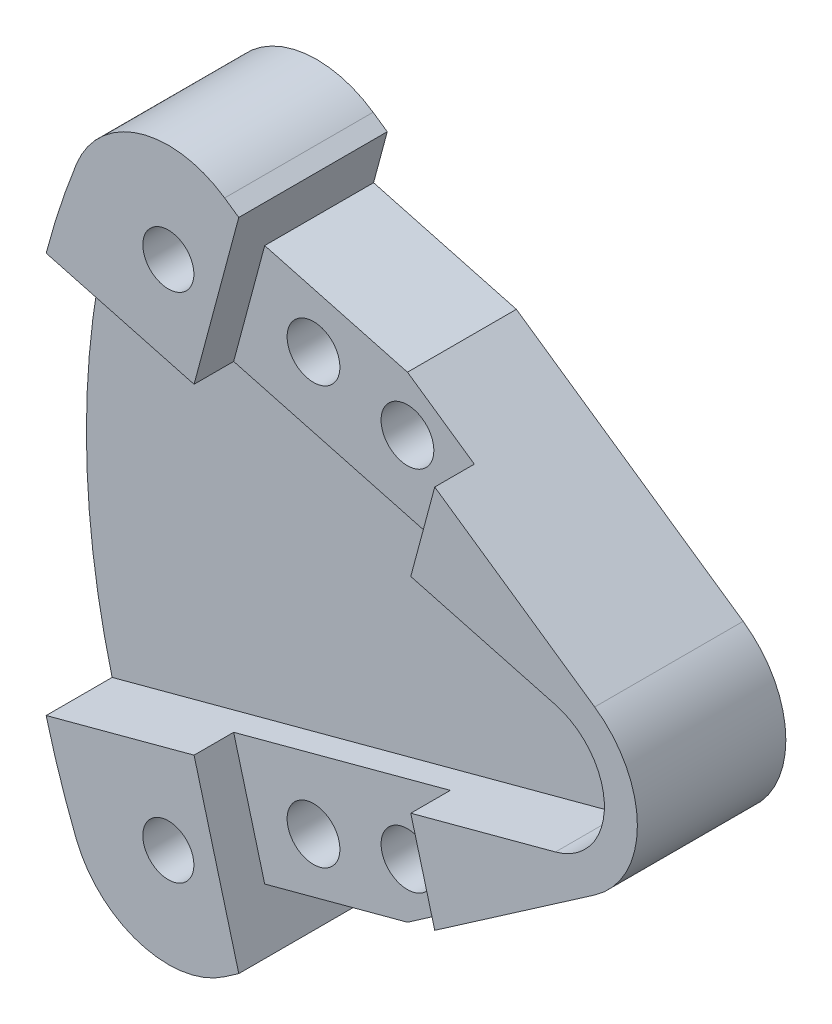
ISO-10303-21;
HEADER;
FILE_DESCRIPTION(('STEP AP214'),'2;1');
FILE_NAME('part.step','',(''),(''),'','','');
FILE_SCHEMA(('AUTOMOTIVE_DESIGN { 1 0 10303 214 1 1 1 1 }'));
ENDSEC;
DATA;
#1=APPLICATION_CONTEXT('core data for automotive mechanical design processes');
#2=APPLICATION_PROTOCOL_DEFINITION('international standard','automotive_design',2000,#1);
#3=PRODUCT_CONTEXT('',#1,'mechanical');
#4=PRODUCT('Part','Part','',(#3));
#5=PRODUCT_RELATED_PRODUCT_CATEGORY('part','',(#4));
#6=PRODUCT_DEFINITION_FORMATION('','',#4);
#7=PRODUCT_DEFINITION_CONTEXT('part definition',#1,'design');
#8=PRODUCT_DEFINITION('design','',#6,#7);
#9=PRODUCT_DEFINITION_SHAPE('','',#8);
#10=(LENGTH_UNIT() NAMED_UNIT(*) SI_UNIT(.MILLI.,.METRE.));
#11=(NAMED_UNIT(*) PLANE_ANGLE_UNIT() SI_UNIT($,.RADIAN.));
#12=(NAMED_UNIT(*) SI_UNIT($,.STERADIAN.) SOLID_ANGLE_UNIT());
#13=UNCERTAINTY_MEASURE_WITH_UNIT(LENGTH_MEASURE(1.E-05),#10,'distance_accuracy_value','');
#14=(GEOMETRIC_REPRESENTATION_CONTEXT(3) GLOBAL_UNCERTAINTY_ASSIGNED_CONTEXT((#13)) GLOBAL_UNIT_ASSIGNED_CONTEXT((#10,
#11,#12)) REPRESENTATION_CONTEXT('',''));
#15=CARTESIAN_POINT('',(0.,0.,0.));
#16=DIRECTION('',(0.,0.,1.));
#17=DIRECTION('',(1.,0.,0.));
#18=AXIS2_PLACEMENT_3D('',#15,#16,#17);
#19=CARTESIAN_POINT('',(33.2996809294023,0.,-12.7));
#20=DIRECTION('',(-0.568627450980392,0.822595175035413,0.));
#21=DIRECTION('',(-0.822595175035413,-0.568627450980392,0.));
#22=AXIS2_PLACEMENT_3D('',#19,#20,#21);
#23=PLANE('',#22);
#24=DIRECTION('',(0.,0.,1.));
#25=VECTOR('',#24,1.);
#26=CARTESIAN_POINT('',(-13.64748248226,-32.4527138885591,0.));
#27=LINE('',#26,#25);
#28=CARTESIAN_POINT('',(-13.64748248226,-32.4527138885591,-14.2875));
#29=VERTEX_POINT('',#28);
#30=CARTESIAN_POINT('',(-13.64748248226,-32.4527138885591,0.));
#31=VERTEX_POINT('',#30);
#32=EDGE_CURVE('E60',#29,#31,#27,.T.);
#33=ORIENTED_EDGE('',*,*,#32,.F.);
#34=DIRECTION('',(-0.822595175035412,-0.568627450980394,0.));
#35=VECTOR('',#34,1.);
#36=CARTESIAN_POINT('',(-12.2859096671348,-31.5115125507863,-14.2875));
#37=LINE('',#36,#35);
#38=CARTESIAN_POINT('',(-12.2859096671348,-31.5115125507863,-14.2875));
#39=VERTEX_POINT('',#38);
#40=EDGE_CURVE('E232',#39,#29,#37,.T.);
#41=ORIENTED_EDGE('',*,*,#40,.F.);
#42=DIRECTION('',(0.,0.,-1.));
#43=VECTOR('',#42,1.);
#44=CARTESIAN_POINT('',(-12.2859096671348,-31.5115125507863,-12.7));
#45=LINE('',#44,#43);
#46=CARTESIAN_POINT('',(-12.2859096671348,-31.5115125507863,0.));
#47=VERTEX_POINT('',#46);
#48=EDGE_CURVE('E322',#47,#39,#45,.T.);
#49=ORIENTED_EDGE('',*,*,#48,.F.);
#50=DIRECTION('',(0.822595175035413,0.568627450980392,0.));
#51=VECTOR('',#50,1.);
#52=CARTESIAN_POINT('',(33.2996809294023,0.,0.));
#53=LINE('',#52,#51);
#54=EDGE_CURVE('E361',#31,#47,#53,.T.);
#55=ORIENTED_EDGE('',*,*,#54,.F.);
#56=EDGE_LOOP('',(#33,#41,#49,#55));
#57=FACE_BOUND('',#56,.T.);
#58=ADVANCED_FACE('F51',(#57),#23,.F.);
#59=CARTESIAN_POINT('',(33.2996809294023,0.,-12.7));
#60=DIRECTION('',(-0.568627450980392,-0.822595175035413,0.));
#61=DIRECTION('',(0.822595175035413,-0.568627450980392,0.));
#62=AXIS2_PLACEMENT_3D('',#59,#60,#61);
#63=PLANE('',#62);
#64=DIRECTION('',(0.,0.,1.));
#65=VECTOR('',#64,1.);
#66=CARTESIAN_POINT('',(-12.2859096671348,31.5115125507863,-12.7));
#67=LINE('',#66,#65);
#68=CARTESIAN_POINT('',(-12.2859096671348,31.5115125507863,-14.2875));
#69=VERTEX_POINT('',#68);
#70=CARTESIAN_POINT('',(-12.2859096671348,31.5115125507863,0.));
#71=VERTEX_POINT('',#70);
#72=EDGE_CURVE('E316',#69,#71,#67,.T.);
#73=ORIENTED_EDGE('',*,*,#72,.F.);
#74=DIRECTION('',(0.822595175035411,-0.568627450980395,0.));
#75=VECTOR('',#74,1.);
#76=CARTESIAN_POINT('',(-13.64748248226,32.4527138885591,-14.2875));
#77=LINE('',#76,#75);
#78=CARTESIAN_POINT('',(-13.64748248226,32.4527138885591,-14.2875));
#79=VERTEX_POINT('',#78);
#80=EDGE_CURVE('E244',#79,#69,#77,.T.);
#81=ORIENTED_EDGE('',*,*,#80,.F.);
#82=DIRECTION('',(0.,0.,1.));
#83=VECTOR('',#82,1.);
#84=CARTESIAN_POINT('',(-13.64748248226,32.4527138885591,-12.7));
#85=LINE('',#84,#83);
#86=CARTESIAN_POINT('',(-13.64748248226,32.4527138885591,0.));
#87=VERTEX_POINT('',#86);
#88=EDGE_CURVE('E387',#87,#79,#85,.F.);
#89=ORIENTED_EDGE('',*,*,#88,.F.);
#90=DIRECTION('',(-0.822595175035413,0.568627450980392,0.));
#91=VECTOR('',#90,1.);
#92=CARTESIAN_POINT('',(33.2996809294023,0.,0.));
#93=LINE('',#92,#91);
#94=EDGE_CURVE('E364',#71,#87,#93,.T.);
#95=ORIENTED_EDGE('',*,*,#94,.F.);
#96=EDGE_LOOP('',(#73,#81,#89,#95));
#97=FACE_BOUND('',#96,.T.);
#98=ADVANCED_FACE('F440',(#97),#63,.F.);
#99=CARTESIAN_POINT('',(0.,0.,0.));
#100=DIRECTION('',(0.,0.,1.));
#101=DIRECTION('',(-1.,0.,0.));
#102=AXIS2_PLACEMENT_3D('',#99,#100,#101);
#103=PLANE('',#102);
#104=DIRECTION('',(-0.258819045102521,0.965925826289068,0.));
#105=VECTOR('',#104,1.);
#106=CARTESIAN_POINT('',(-16.588726312697,-15.4531822138951,0.));
#107=LINE('',#106,#105);
#108=CARTESIAN_POINT('',(-16.588726312697,-15.4531822138951,0.));
#109=VERTEX_POINT('',#108);
#110=EDGE_CURVE('E287',#47,#109,#107,.T.);
#111=ORIENTED_EDGE('',*,*,#110,.T.);
#112=DIRECTION('',(-0.965925826289068,-0.258819045102522,0.));
#113=VECTOR('',#112,1.);
#114=CARTESIAN_POINT('',(-30.8235420478515,-19.2673895945356,0.));
#115=LINE('',#114,#113);
#116=CARTESIAN_POINT('',(-30.8235420478515,-19.2673895945356,0.));
#117=VERTEX_POINT('',#116);
#118=EDGE_CURVE('E344',#109,#117,#115,.T.);
#119=ORIENTED_EDGE('',*,*,#118,.T.);
#120=CARTESIAN_POINT('',(42.9003190705977,0.,0.));
#121=DIRECTION('',(0.,0.,-1.));
#122=DIRECTION('',(-1.,0.,0.));
#123=AXIS2_PLACEMENT_3D('',#120,#121,#122);
#124=CIRCLE('',#123,76.2);
#125=CARTESIAN_POINT('',(-27.9156558133405,-28.1342798243964,0.));
#126=VERTEX_POINT('',#125);
#127=EDGE_CURVE('E369',#126,#117,#124,.T.);
#128=ORIENTED_EDGE('',*,*,#127,.F.);
#129=CARTESIAN_POINT('',(-19.0636589528482,-24.6174948463468,0.));
#130=DIRECTION('',(0.,0.,-1.));
#131=DIRECTION('',(-1.,0.,0.));
#132=AXIS2_PLACEMENT_3D('',#129,#130,#131);
#133=CIRCLE('',#132,9.525);
#134=EDGE_CURVE('E376',#31,#126,#133,.T.);
#135=ORIENTED_EDGE('',*,*,#134,.F.);
#136=ORIENTED_EDGE('',*,*,#54,.T.);
#137=EDGE_LOOP('',(#111,#119,#128,#135,#136));
#138=FACE_BOUND('',#137,.T.);
#139=CARTESIAN_POINT('',(-19.0636589528482,-24.6174948463468,0.));
#140=DIRECTION('',(0.,0.,-1.));
#141=DIRECTION('',(-1.,0.,0.));
#142=AXIS2_PLACEMENT_3D('',#139,#140,#141);
#143=CIRCLE('',#142,2.45745);
#144=CARTESIAN_POINT('',(-21.5211089528482,-24.6174948463468,0.));
#145=VERTEX_POINT('',#144);
#146=EDGE_CURVE('E354',#145,#145,#143,.T.);
#147=ORIENTED_EDGE('',*,*,#146,.T.);
#148=EDGE_LOOP('',(#147));
#149=FACE_BOUND('',#148,.T.);
#150=ADVANCED_FACE('F398',(#138,#149),#103,.T.);
#151=DIRECTION('',(0.258819045102521,0.965925826289068,0.));
#152=VECTOR('',#151,1.);
#153=CARTESIAN_POINT('',(-16.588726312697,15.4531822138951,0.));
#154=LINE('',#153,#152);
#155=CARTESIAN_POINT('',(-16.588726312697,15.4531822138951,0.));
#156=VERTEX_POINT('',#155);
#157=EDGE_CURVE('E276',#156,#71,#154,.T.);
#158=ORIENTED_EDGE('',*,*,#157,.T.);
#159=ORIENTED_EDGE('',*,*,#94,.T.);
#160=CARTESIAN_POINT('',(-19.0636589528482,24.6174948463468,0.));
#161=DIRECTION('',(0.,0.,-1.));
#162=DIRECTION('',(-1.,0.,0.));
#163=AXIS2_PLACEMENT_3D('',#160,#161,#162);
#164=CIRCLE('',#163,9.525);
#165=CARTESIAN_POINT('',(-27.9156558133405,28.1342798243964,0.));
#166=VERTEX_POINT('',#165);
#167=EDGE_CURVE('E381',#166,#87,#164,.T.);
#168=ORIENTED_EDGE('',*,*,#167,.F.);
#169=CARTESIAN_POINT('',(-30.8235420478515,19.2673895945356,0.));
#170=VERTEX_POINT('',#169);
#171=EDGE_CURVE('E368',#170,#166,#124,.T.);
#172=ORIENTED_EDGE('',*,*,#171,.F.);
#173=DIRECTION('',(0.965925826289068,-0.258819045102522,0.));
#174=VECTOR('',#173,1.);
#175=CARTESIAN_POINT('',(-30.8235420478515,19.2673895945356,0.));
#176=LINE('',#175,#174);
#177=EDGE_CURVE('E338',#170,#156,#176,.T.);
#178=ORIENTED_EDGE('',*,*,#177,.T.);
#179=EDGE_LOOP('',(#158,#159,#168,#172,#178));
#180=FACE_BOUND('',#179,.T.);
#181=CARTESIAN_POINT('',(-19.0636589528482,24.6174948463468,0.));
#182=DIRECTION('',(0.,0.,-1.));
#183=DIRECTION('',(-1.,0.,0.));
#184=AXIS2_PLACEMENT_3D('',#181,#182,#183);
#185=CIRCLE('',#184,2.45745);
#186=CARTESIAN_POINT('',(-21.5211089528482,24.6174948463468,0.));
#187=VERTEX_POINT('',#186);
#188=EDGE_CURVE('E357',#187,#187,#185,.T.);
#189=ORIENTED_EDGE('',*,*,#188,.T.);
#190=EDGE_LOOP('',(#189));
#191=FACE_BOUND('',#190,.T.);
#192=ADVANCED_FACE('F431',(#180,#191),#103,.T.);
#193=CARTESIAN_POINT('',(16.5488188604368,0.,-12.7));
#194=DIRECTION('',(0.,0.,-1.));
#195=DIRECTION('',(1.,0.,0.));
#196=AXIS2_PLACEMENT_3D('',#193,#194,#195);
#197=CYLINDRICAL_SURFACE('',#196,2.45745);
#198=CARTESIAN_POINT('',(16.5488188604368,0.,-6.35));
#199=DIRECTION('',(0.,0.,-1.));
#200=DIRECTION('',(-1.,0.,0.));
#201=AXIS2_PLACEMENT_3D('',#198,#199,#200);
#202=CIRCLE('',#201,2.45745);
#203=CARTESIAN_POINT('',(14.0913688604368,0.,-6.35));
#204=VERTEX_POINT('',#203);
#205=EDGE_CURVE('E55',#204,#204,#202,.F.);
#206=ORIENTED_EDGE('',*,*,#205,.T.);
#207=EDGE_LOOP('',(#206));
#208=FACE_BOUND('',#207,.T.);
#209=CARTESIAN_POINT('',(16.5488188604368,0.,-14.2875));
#210=DIRECTION('',(0.,0.,-1.));
#211=DIRECTION('',(-1.,0.,0.));
#212=AXIS2_PLACEMENT_3D('',#209,#210,#211);
#213=CIRCLE('',#212,2.45744999999874);
#214=CARTESIAN_POINT('',(14.091368860438,0.,-14.2875));
#215=VERTEX_POINT('',#214);
#216=EDGE_CURVE('E764',#215,#215,#213,.T.);
#217=ORIENTED_EDGE('',*,*,#216,.T.);
#218=EDGE_LOOP('',(#217));
#219=FACE_BOUND('',#218,.T.);
#220=ADVANCED_FACE('F491',(#208,#219),#197,.F.);
#221=DIRECTION('',(0.822595175035413,0.568627450980392,0.));
#222=VECTOR('',#221,1.);
#223=CARTESIAN_POINT('',(33.2996809294023,0.,-3.81));
#224=LINE('',#223,#222);
#225=CARTESIAN_POINT('',(0.139294206400548,-22.9224614343414,-3.81));
#226=VERTEX_POINT('',#225);
#227=CARTESIAN_POINT('',(6.57266728433622,-18.4753255337996,-3.81));
#228=VERTEX_POINT('',#227);
#229=EDGE_CURVE('E206',#226,#228,#224,.T.);
#230=ORIENTED_EDGE('',*,*,#229,.F.);
#231=DIRECTION('',(0.,0.,1.));
#232=VECTOR('',#231,1.);
#233=CARTESIAN_POINT('',(0.139294206400563,-22.9224614343414,-12.7));
#234=LINE('',#233,#232);
#235=CARTESIAN_POINT('',(0.139294206400561,-22.9224614343414,-14.2875));
#236=VERTEX_POINT('',#235);
#237=EDGE_CURVE('E75',#236,#226,#234,.T.);
#238=ORIENTED_EDGE('',*,*,#237,.F.);
#239=DIRECTION('',(-0.822595175035413,-0.568627450980392,0.));
#240=VECTOR('',#239,1.);
#241=CARTESIAN_POINT('',(21.964995331025,-7.83521904221231,-14.2875));
#242=LINE('',#241,#240);
#243=CARTESIAN_POINT('',(21.964995331025,-7.83521904221231,-14.2875));
#244=VERTEX_POINT('',#243);
#245=EDGE_CURVE('E204',#244,#236,#242,.T.);
#246=ORIENTED_EDGE('',*,*,#245,.F.);
#247=DIRECTION('',(0.,0.,1.));
#248=VECTOR('',#247,1.);
#249=CARTESIAN_POINT('',(21.964995331025,-7.83521904221231,-12.7));
#250=LINE('',#249,#248);
#251=CARTESIAN_POINT('',(21.964995331025,-7.83521904221231,0.));
#252=VERTEX_POINT('',#251);
#253=EDGE_CURVE('E12',#252,#244,#250,.F.);
#254=ORIENTED_EDGE('',*,*,#253,.F.);
#255=CARTESIAN_POINT('',(6.57266728433622,-18.4753255337996,0.));
#256=VERTEX_POINT('',#255);
#257=EDGE_CURVE('E360',#256,#252,#53,.T.);
#258=ORIENTED_EDGE('',*,*,#257,.F.);
#259=DIRECTION('',(0.,0.,1.));
#260=VECTOR('',#259,1.);
#261=CARTESIAN_POINT('',(6.57266728433623,-18.4753255337996,-12.7));
#262=LINE('',#261,#260);
#263=EDGE_CURVE('E319',#228,#256,#262,.T.);
#264=ORIENTED_EDGE('',*,*,#263,.F.);
#265=EDGE_LOOP('',(#230,#238,#246,#254,#258,#264));
#266=FACE_BOUND('',#265,.T.);
#267=ADVANCED_FACE('F201',(#266),#23,.F.);
#268=DIRECTION('',(0.,0.,1.));
#269=VECTOR('',#268,1.);
#270=CARTESIAN_POINT('',(21.964995331025,7.83521904221231,-12.7));
#271=LINE('',#270,#269);
#272=CARTESIAN_POINT('',(21.964995331025,7.83521904221231,-14.2875));
#273=VERTEX_POINT('',#272);
#274=CARTESIAN_POINT('',(21.964995331025,7.83521904221231,0.));
#275=VERTEX_POINT('',#274);
#276=EDGE_CURVE('E384',#273,#275,#271,.T.);
#277=ORIENTED_EDGE('',*,*,#276,.F.);
#278=DIRECTION('',(0.822595175035413,-0.568627450980392,0.));
#279=VECTOR('',#278,1.);
#280=CARTESIAN_POINT('',(0.139294206400561,22.9224614343414,-14.2875));
#281=LINE('',#280,#279);
#282=CARTESIAN_POINT('',(0.139294206400561,22.9224614343414,-14.2875));
#283=VERTEX_POINT('',#282);
#284=EDGE_CURVE('E253',#283,#273,#281,.T.);
#285=ORIENTED_EDGE('',*,*,#284,.F.);
#286=DIRECTION('',(0.,0.,1.));
#287=VECTOR('',#286,1.);
#288=CARTESIAN_POINT('',(0.139294206400563,22.9224614343414,-12.7));
#289=LINE('',#288,#287);
#290=CARTESIAN_POINT('',(0.139294206400563,22.9224614343414,-3.81));
#291=VERTEX_POINT('',#290);
#292=EDGE_CURVE('E258',#283,#291,#289,.T.);
#293=ORIENTED_EDGE('',*,*,#292,.T.);
#294=DIRECTION('',(0.822595175035413,-0.568627450980392,0.));
#295=VECTOR('',#294,1.);
#296=CARTESIAN_POINT('',(33.2996809294023,0.,-3.81));
#297=LINE('',#296,#295);
#298=CARTESIAN_POINT('',(6.57266728433622,18.4753255337996,-3.81));
#299=VERTEX_POINT('',#298);
#300=EDGE_CURVE('E294',#291,#299,#297,.T.);
#301=ORIENTED_EDGE('',*,*,#300,.T.);
#302=DIRECTION('',(0.,0.,-1.));
#303=VECTOR('',#302,1.);
#304=CARTESIAN_POINT('',(6.57266728433623,18.4753255337996,-12.7));
#305=LINE('',#304,#303);
#306=CARTESIAN_POINT('',(6.57266728433622,18.4753255337996,0.));
#307=VERTEX_POINT('',#306);
#308=EDGE_CURVE('E313',#307,#299,#305,.T.);
#309=ORIENTED_EDGE('',*,*,#308,.F.);
#310=EDGE_CURVE('E365',#275,#307,#93,.T.);
#311=ORIENTED_EDGE('',*,*,#310,.F.);
#312=EDGE_LOOP('',(#277,#285,#293,#301,#309,#311));
#313=FACE_BOUND('',#312,.T.);
#314=ADVANCED_FACE('F447',(#313),#63,.F.);
#315=DIRECTION('',(0.258819045102521,-0.965925826289068,0.));
#316=VECTOR('',#315,1.);
#317=CARTESIAN_POINT('',(4.26561227688399,-9.86527903013167,0.));
#318=LINE('',#317,#316);
#319=CARTESIAN_POINT('',(4.26561227688399,-9.86527903013167,0.));
#320=VERTEX_POINT('',#319);
#321=EDGE_CURVE('E280',#320,#256,#318,.T.);
#322=ORIENTED_EDGE('',*,*,#321,.T.);
#323=ORIENTED_EDGE('',*,*,#257,.T.);
#324=CARTESIAN_POINT('',(16.5488188604368,0.,0.));
#325=DIRECTION('',(0.,0.,-1.));
#326=DIRECTION('',(-1.,0.,0.));
#327=AXIS2_PLACEMENT_3D('',#324,#325,#326);
#328=CIRCLE('',#327,9.525);
#329=EDGE_CURVE('E379',#275,#252,#328,.T.);
#330=ORIENTED_EDGE('',*,*,#329,.F.);
#331=ORIENTED_EDGE('',*,*,#310,.T.);
#332=DIRECTION('',(-0.258819045102521,-0.965925826289068,0.));
#333=VECTOR('',#332,1.);
#334=CARTESIAN_POINT('',(4.26561227688399,9.86527903013167,0.));
#335=LINE('',#334,#333);
#336=CARTESIAN_POINT('',(4.26561227688399,9.86527903013167,0.));
#337=VERTEX_POINT('',#336);
#338=EDGE_CURVE('E300',#307,#337,#335,.T.);
#339=ORIENTED_EDGE('',*,*,#338,.T.);
#340=CARTESIAN_POINT('',(18.1923197968378,6.13362899693558,0.));
#341=VERTEX_POINT('',#340);
#342=EDGE_CURVE('E324',#337,#341,#176,.T.);
#343=ORIENTED_EDGE('',*,*,#342,.T.);
#344=CARTESIAN_POINT('',(16.5488188604368,0.,0.));
#345=DIRECTION('',(0.,0.,-1.));
#346=DIRECTION('',(-1.,0.,0.));
#347=AXIS2_PLACEMENT_3D('',#344,#345,#346);
#348=CIRCLE('',#347,6.35);
#349=CARTESIAN_POINT('',(18.1923197968378,-6.13362899693558,0.));
#350=VERTEX_POINT('',#349);
#351=EDGE_CURVE('E341',#341,#350,#348,.T.);
#352=ORIENTED_EDGE('',*,*,#351,.T.);
#353=EDGE_CURVE('E329',#350,#320,#115,.T.);
#354=ORIENTED_EDGE('',*,*,#353,.T.);
#355=EDGE_LOOP('',(#322,#323,#330,#331,#339,#343,#352,#354));
#356=FACE_BOUND('',#355,.T.);
#357=ADVANCED_FACE('F459',(#356),#103,.T.);
#358=CARTESIAN_POINT('',(42.9003190705977,0.,0.));
#359=DIRECTION('',(0.,0.,-1.));
#360=DIRECTION('',(1.,0.,0.));
#361=AXIS2_PLACEMENT_3D('',#358,#359,#360);
#362=CYLINDRICAL_SURFACE('',#361,76.2);
#363=DIRECTION('',(0.,0.,1.));
#364=VECTOR('',#363,1.);
#365=CARTESIAN_POINT('',(-30.8235420478515,-19.2673895945356,-6.35));
#366=LINE('',#365,#364);
#367=CARTESIAN_POINT('',(-30.8235420478515,-19.2673895945356,-6.35));
#368=VERTEX_POINT('',#367);
#369=EDGE_CURVE('E347',#368,#117,#366,.T.);
#370=ORIENTED_EDGE('',*,*,#369,.F.);
#371=CARTESIAN_POINT('',(42.9003190705977,0.,-6.35));
#372=DIRECTION('',(0.,0.,-1.));
#373=DIRECTION('',(-1.,0.,0.));
#374=AXIS2_PLACEMENT_3D('',#371,#372,#373);
#375=CIRCLE('',#374,76.2);
#376=CARTESIAN_POINT('',(-30.8235420478515,19.2673895945356,-6.35));
#377=VERTEX_POINT('',#376);
#378=EDGE_CURVE('E325',#368,#377,#375,.T.);
#379=ORIENTED_EDGE('',*,*,#378,.T.);
#380=DIRECTION('',(0.,0.,1.));
#381=VECTOR('',#380,1.);
#382=CARTESIAN_POINT('',(-30.8235420478515,19.2673895945356,-6.35));
#383=LINE('',#382,#381);
#384=EDGE_CURVE('E337',#377,#170,#383,.T.);
#385=ORIENTED_EDGE('',*,*,#384,.T.);
#386=ORIENTED_EDGE('',*,*,#171,.T.);
#387=DIRECTION('',(0.,0.,-1.));
#388=VECTOR('',#387,1.);
#389=CARTESIAN_POINT('',(-27.9156558133405,28.1342798243964,0.));
#390=LINE('',#389,#388);
#391=CARTESIAN_POINT('',(-27.9156558133405,28.1342798243964,-14.2875));
#392=VERTEX_POINT('',#391);
#393=EDGE_CURVE('E374',#392,#166,#390,.F.);
#394=ORIENTED_EDGE('',*,*,#393,.F.);
#395=CARTESIAN_POINT('',(42.9003190705977,0.,-14.2875000000001));
#396=DIRECTION('',(0.,0.,-1.));
#397=DIRECTION('',(-1.,0.,0.));
#398=AXIS2_PLACEMENT_3D('',#395,#396,#397);
#399=CIRCLE('',#398,76.2);
#400=CARTESIAN_POINT('',(-27.9156558133405,-28.1342798243964,-14.2875));
#401=VERTEX_POINT('',#400);
#402=EDGE_CURVE('E238',#401,#392,#399,.T.);
#403=ORIENTED_EDGE('',*,*,#402,.F.);
#404=DIRECTION('',(0.,0.,-1.));
#405=VECTOR('',#404,1.);
#406=CARTESIAN_POINT('',(-27.9156558133405,-28.1342798243964,0.));
#407=LINE('',#406,#405);
#408=EDGE_CURVE('E372',#126,#401,#407,.T.);
#409=ORIENTED_EDGE('',*,*,#408,.F.);
#410=ORIENTED_EDGE('',*,*,#127,.T.);
#411=EDGE_LOOP('',(#370,#379,#385,#386,#394,#403,#409,#410));
#412=FACE_BOUND('',#411,.T.);
#413=ADVANCED_FACE('F404',(#412),#362,.T.);
#414=CARTESIAN_POINT('',(-19.0636589528482,24.6174948463468,0.));
#415=DIRECTION('',(0.,0.,-1.));
#416=DIRECTION('',(1.,0.,0.));
#417=AXIS2_PLACEMENT_3D('',#414,#415,#416);
#418=CYLINDRICAL_SURFACE('',#417,9.525);
#419=ORIENTED_EDGE('',*,*,#88,.T.);
#420=CARTESIAN_POINT('',(-19.0636589528482,24.6174948463468,-14.2875));
#421=DIRECTION('',(0.,0.,-1.));
#422=DIRECTION('',(-1.,0.,0.));
#423=AXIS2_PLACEMENT_3D('',#420,#421,#422);
#424=CIRCLE('',#423,9.525);
#425=EDGE_CURVE('E241',#392,#79,#424,.T.);
#426=ORIENTED_EDGE('',*,*,#425,.F.);
#427=ORIENTED_EDGE('',*,*,#393,.T.);
#428=ORIENTED_EDGE('',*,*,#167,.T.);
#429=EDGE_LOOP('',(#419,#426,#427,#428));
#430=FACE_BOUND('',#429,.T.);
#431=ADVANCED_FACE('F436',(#430),#418,.T.);
#432=CARTESIAN_POINT('',(16.5488188604368,0.,-12.7));
#433=DIRECTION('',(0.,0.,1.));
#434=DIRECTION('',(-1.,0.,0.));
#435=AXIS2_PLACEMENT_3D('',#432,#433,#434);
#436=CYLINDRICAL_SURFACE('',#435,9.525);
#437=ORIENTED_EDGE('',*,*,#253,.T.);
#438=CARTESIAN_POINT('',(16.5488188604368,0.,-14.2875));
#439=DIRECTION('',(0.,0.,-1.));
#440=DIRECTION('',(-1.,0.,0.));
#441=AXIS2_PLACEMENT_3D('',#438,#439,#440);
#442=CIRCLE('',#441,9.525);
#443=EDGE_CURVE('E223',#273,#244,#442,.T.);
#444=ORIENTED_EDGE('',*,*,#443,.F.);
#445=ORIENTED_EDGE('',*,*,#276,.T.);
#446=ORIENTED_EDGE('',*,*,#329,.T.);
#447=EDGE_LOOP('',(#437,#444,#445,#446));
#448=FACE_BOUND('',#447,.T.);
#449=ADVANCED_FACE('F464',(#448),#436,.T.);
#450=CARTESIAN_POINT('',(-19.0636589528482,-24.6174948463468,0.));
#451=DIRECTION('',(0.,0.,-1.));
#452=DIRECTION('',(1.,0.,0.));
#453=AXIS2_PLACEMENT_3D('',#450,#451,#452);
#454=CYLINDRICAL_SURFACE('',#453,9.525);
#455=ORIENTED_EDGE('',*,*,#134,.T.);
#456=ORIENTED_EDGE('',*,*,#408,.T.);
#457=CARTESIAN_POINT('',(-19.0636589528482,-24.6174948463468,-14.2875));
#458=DIRECTION('',(0.,0.,-1.));
#459=DIRECTION('',(-1.,0.,0.));
#460=AXIS2_PLACEMENT_3D('',#457,#458,#459);
#461=CIRCLE('',#460,9.525);
#462=EDGE_CURVE('E235',#29,#401,#461,.T.);
#463=ORIENTED_EDGE('',*,*,#462,.F.);
#464=ORIENTED_EDGE('',*,*,#32,.T.);
#465=EDGE_LOOP('',(#455,#456,#463,#464));
#466=FACE_BOUND('',#465,.T.);
#467=ADVANCED_FACE('F53',(#466),#454,.T.);
#468=CARTESIAN_POINT('',(-19.0636589528482,24.6174948463468,-12.7));
#469=DIRECTION('',(0.,0.,-1.));
#470=DIRECTION('',(1.,0.,0.));
#471=AXIS2_PLACEMENT_3D('',#468,#469,#470);
#472=CYLINDRICAL_SURFACE('',#471,2.45745);
#473=ORIENTED_EDGE('',*,*,#188,.F.);
#474=EDGE_LOOP('',(#473));
#475=FACE_BOUND('',#474,.T.);
#476=CARTESIAN_POINT('',(-19.0636589528482,24.6174948463468,-14.2875));
#477=DIRECTION('',(0.,0.,-1.));
#478=DIRECTION('',(-1.,0.,0.));
#479=AXIS2_PLACEMENT_3D('',#476,#477,#478);
#480=CIRCLE('',#479,2.4574499999988);
#481=CARTESIAN_POINT('',(-21.521108952847,24.6174948463468,-14.2875));
#482=VERTEX_POINT('',#481);
#483=EDGE_CURVE('E777',#482,#482,#480,.T.);
#484=ORIENTED_EDGE('',*,*,#483,.T.);
#485=EDGE_LOOP('',(#484));
#486=FACE_BOUND('',#485,.T.);
#487=ADVANCED_FACE('F506',(#475,#486),#472,.F.);
#488=CARTESIAN_POINT('',(-19.0636589528482,-24.6174948463468,-12.7));
#489=DIRECTION('',(0.,0.,-1.));
#490=DIRECTION('',(1.,0.,0.));
#491=AXIS2_PLACEMENT_3D('',#488,#489,#490);
#492=CYLINDRICAL_SURFACE('',#491,2.45745);
#493=ORIENTED_EDGE('',*,*,#146,.F.);
#494=EDGE_LOOP('',(#493));
#495=FACE_BOUND('',#494,.T.);
#496=CARTESIAN_POINT('',(-19.0636589528482,-24.6174948463468,-14.2875));
#497=DIRECTION('',(0.,0.,-1.));
#498=DIRECTION('',(-1.,0.,0.));
#499=AXIS2_PLACEMENT_3D('',#496,#497,#498);
#500=CIRCLE('',#499,2.45745000000022);
#501=CARTESIAN_POINT('',(-21.5211089528485,-24.6174948463468,-14.2875));
#502=VERTEX_POINT('',#501);
#503=EDGE_CURVE('E224',#502,#502,#500,.T.);
#504=ORIENTED_EDGE('',*,*,#503,.T.);
#505=EDGE_LOOP('',(#504));
#506=FACE_BOUND('',#505,.T.);
#507=ADVANCED_FACE('F578',(#495,#506),#492,.F.);
#508=CARTESIAN_POINT('',(42.9003190705977,0.,-6.35));
#509=DIRECTION('',(0.,0.,1.));
#510=DIRECTION('',(-1.,0.,0.));
#511=AXIS2_PLACEMENT_3D('',#508,#509,#510);
#512=PLANE('',#511);
#513=ORIENTED_EDGE('',*,*,#378,.F.);
#514=DIRECTION('',(-0.965925826289068,-0.258819045102522,0.));
#515=VECTOR('',#514,1.);
#516=CARTESIAN_POINT('',(-30.8235420478515,-19.2673895945356,-6.35));
#517=LINE('',#516,#515);
#518=CARTESIAN_POINT('',(18.1923197968378,-6.13362899693558,-6.35));
#519=VERTEX_POINT('',#518);
#520=EDGE_CURVE('E335',#519,#368,#517,.T.);
#521=ORIENTED_EDGE('',*,*,#520,.F.);
#522=CARTESIAN_POINT('',(16.5488188604368,0.,-6.35));
#523=DIRECTION('',(0.,0.,-1.));
#524=DIRECTION('',(-1.,0.,0.));
#525=AXIS2_PLACEMENT_3D('',#522,#523,#524);
#526=CIRCLE('',#525,6.35);
#527=CARTESIAN_POINT('',(18.1923197968378,6.13362899693558,-6.35));
#528=VERTEX_POINT('',#527);
#529=EDGE_CURVE('E332',#528,#519,#526,.T.);
#530=ORIENTED_EDGE('',*,*,#529,.F.);
#531=DIRECTION('',(0.965925826289068,-0.258819045102522,0.));
#532=VECTOR('',#531,1.);
#533=CARTESIAN_POINT('',(-30.8235420478515,19.2673895945356,-6.35));
#534=LINE('',#533,#532);
#535=EDGE_CURVE('E328',#377,#528,#534,.T.);
#536=ORIENTED_EDGE('',*,*,#535,.F.);
#537=EDGE_LOOP('',(#513,#521,#530,#536));
#538=FACE_BOUND('',#537,.T.);
#539=ORIENTED_EDGE('',*,*,#205,.F.);
#540=EDGE_LOOP('',(#539));
#541=FACE_BOUND('',#540,.T.);
#542=ADVANCED_FACE('F419',(#538,#541),#512,.T.);
#543=CARTESIAN_POINT('',(-30.8235420478515,-19.2673895945356,-6.35));
#544=DIRECTION('',(0.258819045102522,-0.965925826289068,0.));
#545=DIRECTION('',(0.965925826289068,0.258819045102522,0.));
#546=AXIS2_PLACEMENT_3D('',#543,#544,#545);
#547=PLANE('',#546);
#548=DIRECTION('',(0.965925826289068,0.258819045102521,0.));
#549=VECTOR('',#548,1.);
#550=CARTESIAN_POINT('',(-16.588726312697,-15.4531822138951,-3.81));
#551=LINE('',#550,#549);
#552=CARTESIAN_POINT('',(-16.588726312697,-15.4531822138951,-3.81));
#553=VERTEX_POINT('',#552);
#554=CARTESIAN_POINT('',(4.26561227688399,-9.86527903013167,-3.81));
#555=VERTEX_POINT('',#554);
#556=EDGE_CURVE('E279',#553,#555,#551,.T.);
#557=ORIENTED_EDGE('',*,*,#556,.T.);
#558=DIRECTION('',(0.,0.,1.));
#559=VECTOR('',#558,1.);
#560=CARTESIAN_POINT('',(4.26561227688399,-9.86527903013167,-3.81));
#561=LINE('',#560,#559);
#562=EDGE_CURVE('E292',#555,#320,#561,.T.);
#563=ORIENTED_EDGE('',*,*,#562,.T.);
#564=ORIENTED_EDGE('',*,*,#353,.F.);
#565=DIRECTION('',(0.,0.,1.));
#566=VECTOR('',#565,1.);
#567=CARTESIAN_POINT('',(18.1923197968378,-6.13362899693558,-6.35));
#568=LINE('',#567,#566);
#569=EDGE_CURVE('E349',#519,#350,#568,.T.);
#570=ORIENTED_EDGE('',*,*,#569,.F.);
#571=ORIENTED_EDGE('',*,*,#520,.T.);
#572=ORIENTED_EDGE('',*,*,#369,.T.);
#573=ORIENTED_EDGE('',*,*,#118,.F.);
#574=DIRECTION('',(0.,0.,1.));
#575=VECTOR('',#574,1.);
#576=CARTESIAN_POINT('',(-16.588726312697,-15.4531822138951,-3.81));
#577=LINE('',#576,#575);
#578=EDGE_CURVE('E286',#553,#109,#577,.T.);
#579=ORIENTED_EDGE('',*,*,#578,.F.);
#580=EDGE_LOOP('',(#557,#563,#564,#570,#571,#572,#573,#579));
#581=FACE_BOUND('',#580,.T.);
#582=ADVANCED_FACE('F413',(#581),#547,.F.);
#583=CARTESIAN_POINT('',(16.5488188604368,0.,-6.35));
#584=DIRECTION('',(0.,0.,1.));
#585=DIRECTION('',(-1.,0.,0.));
#586=AXIS2_PLACEMENT_3D('',#583,#584,#585);
#587=CYLINDRICAL_SURFACE('',#586,6.35);
#588=ORIENTED_EDGE('',*,*,#351,.F.);
#589=DIRECTION('',(0.,0.,1.));
#590=VECTOR('',#589,1.);
#591=CARTESIAN_POINT('',(18.1923197968378,6.13362899693558,-6.35));
#592=LINE('',#591,#590);
#593=EDGE_CURVE('E351',#528,#341,#592,.T.);
#594=ORIENTED_EDGE('',*,*,#593,.F.);
#595=ORIENTED_EDGE('',*,*,#529,.T.);
#596=ORIENTED_EDGE('',*,*,#569,.T.);
#597=EDGE_LOOP('',(#588,#594,#595,#596));
#598=FACE_BOUND('',#597,.T.);
#599=ADVANCED_FACE('F474',(#598),#587,.F.);
#600=CARTESIAN_POINT('',(-30.8235420478515,19.2673895945356,-6.35));
#601=DIRECTION('',(0.258819045102522,0.965925826289068,0.));
#602=DIRECTION('',(-0.965925826289068,0.258819045102522,0.));
#603=AXIS2_PLACEMENT_3D('',#600,#601,#602);
#604=PLANE('',#603);
#605=ORIENTED_EDGE('',*,*,#177,.F.);
#606=ORIENTED_EDGE('',*,*,#384,.F.);
#607=ORIENTED_EDGE('',*,*,#535,.T.);
#608=ORIENTED_EDGE('',*,*,#593,.T.);
#609=ORIENTED_EDGE('',*,*,#342,.F.);
#610=DIRECTION('',(0.,0.,1.));
#611=VECTOR('',#610,1.);
#612=CARTESIAN_POINT('',(4.26561227688399,9.86527903013167,-3.81));
#613=LINE('',#612,#611);
#614=CARTESIAN_POINT('',(4.26561227688398,9.86527903013167,-3.81));
#615=VERTEX_POINT('',#614);
#616=EDGE_CURVE('E305',#615,#337,#613,.T.);
#617=ORIENTED_EDGE('',*,*,#616,.F.);
#618=DIRECTION('',(-0.965925826289068,0.258819045102521,0.));
#619=VECTOR('',#618,1.);
#620=CARTESIAN_POINT('',(-16.588726312697,15.4531822138951,-3.81));
#621=LINE('',#620,#619);
#622=CARTESIAN_POINT('',(-16.588726312697,15.4531822138951,-3.81));
#623=VERTEX_POINT('',#622);
#624=EDGE_CURVE('E302',#615,#623,#621,.T.);
#625=ORIENTED_EDGE('',*,*,#624,.T.);
#626=DIRECTION('',(0.,0.,1.));
#627=VECTOR('',#626,1.);
#628=CARTESIAN_POINT('',(-16.588726312697,15.4531822138951,-3.81));
#629=LINE('',#628,#627);
#630=EDGE_CURVE('E290',#623,#156,#629,.T.);
#631=ORIENTED_EDGE('',*,*,#630,.T.);
#632=EDGE_LOOP('',(#605,#606,#607,#608,#609,#617,#625,#631));
#633=FACE_BOUND('',#632,.T.);
#634=ADVANCED_FACE('F427',(#633),#604,.F.);
#635=CARTESIAN_POINT('',(-16.588726312697,15.4531822138951,-3.81));
#636=DIRECTION('',(-0.965925826289068,0.258819045102521,0.));
#637=DIRECTION('',(-0.258819045102521,-0.965925826289068,0.));
#638=AXIS2_PLACEMENT_3D('',#635,#636,#637);
#639=PLANE('',#638);
#640=DIRECTION('',(0.258819045102521,0.965925826289068,0.));
#641=VECTOR('',#640,1.);
#642=CARTESIAN_POINT('',(-16.588726312697,15.4531822138951,-3.81));
#643=LINE('',#642,#641);
#644=CARTESIAN_POINT('',(-13.6008416103194,26.6041197303259,-3.81));
#645=VERTEX_POINT('',#644);
#646=EDGE_CURVE('E296',#623,#645,#643,.T.);
#647=ORIENTED_EDGE('',*,*,#646,.T.);
#648=DIRECTION('',(0.,0.,1.));
#649=VECTOR('',#648,1.);
#650=CARTESIAN_POINT('',(-13.6008416103194,26.6041197303259,-12.7));
#651=LINE('',#650,#649);
#652=CARTESIAN_POINT('',(-13.6008416103195,26.6041197303259,-14.2875));
#653=VERTEX_POINT('',#652);
#654=EDGE_CURVE('E67',#653,#645,#651,.T.);
#655=ORIENTED_EDGE('',*,*,#654,.F.);
#656=DIRECTION('',(-0.258819045102521,-0.965925826289068,0.));
#657=VECTOR('',#656,1.);
#658=CARTESIAN_POINT('',(-12.2859096671348,31.5115125507863,-14.2875));
#659=LINE('',#658,#657);
#660=EDGE_CURVE('E247',#69,#653,#659,.T.);
#661=ORIENTED_EDGE('',*,*,#660,.F.);
#662=ORIENTED_EDGE('',*,*,#72,.T.);
#663=ORIENTED_EDGE('',*,*,#157,.F.);
#664=ORIENTED_EDGE('',*,*,#630,.F.);
#665=EDGE_LOOP('',(#647,#655,#661,#662,#663,#664));
#666=FACE_BOUND('',#665,.T.);
#667=ADVANCED_FACE('F442',(#666),#639,.F.);
#668=CARTESIAN_POINT('',(4.26561227688399,9.86527903013167,-3.81));
#669=DIRECTION('',(0.965925826289068,-0.258819045102521,0.));
#670=DIRECTION('',(0.258819045102521,0.965925826289068,0.));
#671=AXIS2_PLACEMENT_3D('',#668,#669,#670);
#672=PLANE('',#671);
#673=ORIENTED_EDGE('',*,*,#338,.F.);
#674=ORIENTED_EDGE('',*,*,#308,.T.);
#675=DIRECTION('',(-0.258819045102521,-0.965925826289068,0.));
#676=VECTOR('',#675,1.);
#677=CARTESIAN_POINT('',(4.26561227688399,9.86527903013167,-3.81));
#678=LINE('',#677,#676);
#679=EDGE_CURVE('E299',#299,#615,#678,.T.);
#680=ORIENTED_EDGE('',*,*,#679,.T.);
#681=ORIENTED_EDGE('',*,*,#616,.T.);
#682=EDGE_LOOP('',(#673,#674,#680,#681));
#683=FACE_BOUND('',#682,.T.);
#684=ADVANCED_FACE('F456',(#683),#672,.F.);
#685=CARTESIAN_POINT('',(0.,0.,-3.81));
#686=DIRECTION('',(0.,0.,1.));
#687=DIRECTION('',(-1.,0.,0.));
#688=AXIS2_PLACEMENT_3D('',#685,#686,#687);
#689=PLANE('',#688);
#690=DIRECTION('',(0.96592582628906,-0.25881904510255,0.));
#691=VECTOR('',#690,1.);
#692=CARTESIAN_POINT('',(-13.6008416103194,26.6041197303259,-3.81));
#693=LINE('',#692,#691);
#694=EDGE_CURVE('E256',#645,#291,#693,.T.);
#695=ORIENTED_EDGE('',*,*,#694,.F.);
#696=ORIENTED_EDGE('',*,*,#646,.F.);
#697=ORIENTED_EDGE('',*,*,#624,.F.);
#698=ORIENTED_EDGE('',*,*,#679,.F.);
#699=ORIENTED_EDGE('',*,*,#300,.F.);
#700=EDGE_LOOP('',(#695,#696,#697,#698,#699));
#701=FACE_BOUND('',#700,.T.);
#702=CARTESIAN_POINT('',(-8.9046859424435,20.086585615104,-3.81));
#703=DIRECTION('',(0.,0.,1.));
#704=DIRECTION('',(1.,0.,0.));
#705=AXIS2_PLACEMENT_3D('',#702,#703,#704);
#706=CIRCLE('',#705,2.54);
#707=CARTESIAN_POINT('',(-6.36468594244349,20.086585615104,-3.81));
#708=VERTEX_POINT('',#707);
#709=EDGE_CURVE('E267',#708,#708,#706,.T.);
#710=ORIENTED_EDGE('',*,*,#709,.F.);
#711=EDGE_LOOP('',(#710));
#712=FACE_BOUND('',#711,.T.);
#713=CARTESIAN_POINT('',(0.136283199039557,17.6640652348489,-3.81));
#714=DIRECTION('',(0.,0.,1.));
#715=DIRECTION('',(1.,0.,0.));
#716=AXIS2_PLACEMENT_3D('',#713,#714,#715);
#717=CIRCLE('',#716,2.54);
#718=CARTESIAN_POINT('',(2.67628319903956,17.6640652348489,-3.81));
#719=VERTEX_POINT('',#718);
#720=EDGE_CURVE('E259',#719,#719,#717,.T.);
#721=ORIENTED_EDGE('',*,*,#720,.F.);
#722=EDGE_LOOP('',(#721));
#723=FACE_BOUND('',#722,.T.);
#724=ADVANCED_FACE('F451',(#701,#712,#723),#689,.T.);
#725=CARTESIAN_POINT('',(-16.588726312697,-15.4531822138951,-3.81));
#726=DIRECTION('',(-0.965925826289068,-0.258819045102521,0.));
#727=DIRECTION('',(0.258819045102521,-0.965925826289068,0.));
#728=AXIS2_PLACEMENT_3D('',#725,#726,#727);
#729=PLANE('',#728);
#730=ORIENTED_EDGE('',*,*,#110,.F.);
#731=ORIENTED_EDGE('',*,*,#48,.T.);
#732=DIRECTION('',(0.258819045102521,-0.965925826289068,0.));
#733=VECTOR('',#732,1.);
#734=CARTESIAN_POINT('',(-13.6008416103196,-26.6041197303255,-14.2875));
#735=LINE('',#734,#733);
#736=CARTESIAN_POINT('',(-13.6008416103196,-26.6041197303255,-14.2875));
#737=VERTEX_POINT('',#736);
#738=EDGE_CURVE('E216',#737,#39,#735,.T.);
#739=ORIENTED_EDGE('',*,*,#738,.F.);
#740=DIRECTION('',(0.,0.,1.));
#741=VECTOR('',#740,1.);
#742=CARTESIAN_POINT('',(-13.6008416103196,-26.6041197303255,-12.7));
#743=LINE('',#742,#741);
#744=CARTESIAN_POINT('',(-13.6008416103196,-26.6041197303255,-3.81));
#745=VERTEX_POINT('',#744);
#746=EDGE_CURVE('E207',#737,#745,#743,.T.);
#747=ORIENTED_EDGE('',*,*,#746,.T.);
#748=DIRECTION('',(-0.258819045102521,0.965925826289068,0.));
#749=VECTOR('',#748,1.);
#750=CARTESIAN_POINT('',(-16.588726312697,-15.4531822138951,-3.81));
#751=LINE('',#750,#749);
#752=EDGE_CURVE('E277',#745,#553,#751,.T.);
#753=ORIENTED_EDGE('',*,*,#752,.T.);
#754=ORIENTED_EDGE('',*,*,#578,.T.);
#755=EDGE_LOOP('',(#730,#731,#739,#747,#753,#754));
#756=FACE_BOUND('',#755,.T.);
#757=ADVANCED_FACE('F408',(#756),#729,.F.);
#758=CARTESIAN_POINT('',(4.26561227688399,-9.86527903013167,-3.81));
#759=DIRECTION('',(0.965925826289068,0.258819045102521,0.));
#760=DIRECTION('',(-0.258819045102521,0.965925826289068,0.));
#761=AXIS2_PLACEMENT_3D('',#758,#759,#760);
#762=PLANE('',#761);
#763=DIRECTION('',(0.258819045102521,-0.965925826289068,0.));
#764=VECTOR('',#763,1.);
#765=CARTESIAN_POINT('',(4.26561227688399,-9.86527903013167,-3.81));
#766=LINE('',#765,#764);
#767=EDGE_CURVE('E283',#555,#228,#766,.T.);
#768=ORIENTED_EDGE('',*,*,#767,.T.);
#769=ORIENTED_EDGE('',*,*,#263,.T.);
#770=ORIENTED_EDGE('',*,*,#321,.F.);
#771=ORIENTED_EDGE('',*,*,#562,.F.);
#772=EDGE_LOOP('',(#768,#769,#770,#771));
#773=FACE_BOUND('',#772,.T.);
#774=ADVANCED_FACE('F467',(#773),#762,.F.);
#775=CARTESIAN_POINT('',(0.,0.,-3.81));
#776=DIRECTION('',(0.,0.,-1.));
#777=DIRECTION('',(1.,0.,0.));
#778=AXIS2_PLACEMENT_3D('',#775,#776,#777);
#779=PLANE('',#778);
#780=CARTESIAN_POINT('',(0.136283199039551,-17.6640652348489,-3.81));
#781=DIRECTION('',(0.,0.,1.));
#782=DIRECTION('',(1.,0.,0.));
#783=AXIS2_PLACEMENT_3D('',#780,#781,#782);
#784=CIRCLE('',#783,2.54);
#785=CARTESIAN_POINT('',(2.67628319903955,-17.6640652348489,-3.81));
#786=VERTEX_POINT('',#785);
#787=EDGE_CURVE('E268',#786,#786,#784,.T.);
#788=ORIENTED_EDGE('',*,*,#787,.F.);
#789=EDGE_LOOP('',(#788));
#790=FACE_BOUND('',#789,.T.);
#791=CARTESIAN_POINT('',(-8.9046859424435,-20.086585615104,-3.81));
#792=DIRECTION('',(0.,0.,1.));
#793=DIRECTION('',(1.,0.,0.));
#794=AXIS2_PLACEMENT_3D('',#791,#792,#793);
#795=CIRCLE('',#794,2.54);
#796=CARTESIAN_POINT('',(-6.3646859424435,-20.086585615104,-3.81));
#797=VERTEX_POINT('',#796);
#798=EDGE_CURVE('E271',#797,#797,#795,.T.);
#799=ORIENTED_EDGE('',*,*,#798,.F.);
#800=EDGE_LOOP('',(#799));
#801=FACE_BOUND('',#800,.T.);
#802=ORIENTED_EDGE('',*,*,#752,.F.);
#803=DIRECTION('',(-0.965925826289068,-0.258819045102521,0.));
#804=VECTOR('',#803,1.);
#805=CARTESIAN_POINT('',(-13.6008416103196,-26.6041197303255,-3.81));
#806=LINE('',#805,#804);
#807=EDGE_CURVE('E208',#226,#745,#806,.T.);
#808=ORIENTED_EDGE('',*,*,#807,.F.);
#809=ORIENTED_EDGE('',*,*,#229,.T.);
#810=ORIENTED_EDGE('',*,*,#767,.F.);
#811=ORIENTED_EDGE('',*,*,#556,.F.);
#812=EDGE_LOOP('',(#802,#808,#809,#810,#811));
#813=FACE_BOUND('',#812,.T.);
#814=ADVANCED_FACE('F470',(#790,#801,#813),#779,.F.);
#815=CARTESIAN_POINT('',(-8.9046859424435,-20.086585615104,-12.701));
#816=DIRECTION('',(0.,0.,1.));
#817=DIRECTION('',(1.,0.,0.));
#818=AXIS2_PLACEMENT_3D('',#815,#816,#817);
#819=CYLINDRICAL_SURFACE('',#818,2.54);
#820=ORIENTED_EDGE('',*,*,#798,.T.);
#821=EDGE_LOOP('',(#820));
#822=FACE_BOUND('',#821,.T.);
#823=CARTESIAN_POINT('',(-8.9046859424435,-20.086585615104,-14.2875));
#824=DIRECTION('',(0.,0.,-1.));
#825=DIRECTION('',(-1.,0.,0.));
#826=AXIS2_PLACEMENT_3D('',#823,#824,#825);
#827=CIRCLE('',#826,2.54000000000045);
#828=CARTESIAN_POINT('',(-11.4446859424439,-20.086585615104,-14.2875));
#829=VERTEX_POINT('',#828);
#830=EDGE_CURVE('E227',#829,#829,#827,.T.);
#831=ORIENTED_EDGE('',*,*,#830,.T.);
#832=EDGE_LOOP('',(#831));
#833=FACE_BOUND('',#832,.T.);
#834=ADVANCED_FACE('F593',(#822,#833),#819,.F.);
#835=CARTESIAN_POINT('',(0.136283199039551,-17.6640652348489,-12.701));
#836=DIRECTION('',(0.,0.,1.));
#837=DIRECTION('',(1.,0.,0.));
#838=AXIS2_PLACEMENT_3D('',#835,#836,#837);
#839=CYLINDRICAL_SURFACE('',#838,2.54);
#840=ORIENTED_EDGE('',*,*,#787,.T.);
#841=EDGE_LOOP('',(#840));
#842=FACE_BOUND('',#841,.T.);
#843=CARTESIAN_POINT('',(0.136283199039549,-17.6640652348489,-14.2875));
#844=DIRECTION('',(0.,0.,-1.));
#845=DIRECTION('',(-1.,0.,0.));
#846=AXIS2_PLACEMENT_3D('',#843,#844,#845);
#847=CIRCLE('',#846,2.54000000000014);
#848=CARTESIAN_POINT('',(-2.40371680096059,-17.6640652348489,-14.2875));
#849=VERTEX_POINT('',#848);
#850=EDGE_CURVE('E768',#849,#849,#847,.T.);
#851=ORIENTED_EDGE('',*,*,#850,.T.);
#852=EDGE_LOOP('',(#851));
#853=FACE_BOUND('',#852,.T.);
#854=ADVANCED_FACE('F694',(#842,#853),#839,.F.);
#855=CARTESIAN_POINT('',(0.136283199039557,17.6640652348489,-12.701));
#856=DIRECTION('',(0.,0.,1.));
#857=DIRECTION('',(1.,0.,0.));
#858=AXIS2_PLACEMENT_3D('',#855,#856,#857);
#859=CYLINDRICAL_SURFACE('',#858,2.54);
#860=ORIENTED_EDGE('',*,*,#720,.T.);
#861=EDGE_LOOP('',(#860));
#862=FACE_BOUND('',#861,.T.);
#863=CARTESIAN_POINT('',(0.136283199039555,17.6640652348489,-14.2875));
#864=DIRECTION('',(0.,0.,-1.));
#865=DIRECTION('',(-1.,0.,0.));
#866=AXIS2_PLACEMENT_3D('',#863,#864,#865);
#867=CIRCLE('',#866,2.53999999999978);
#868=CARTESIAN_POINT('',(-2.40371680096022,17.6640652348489,-14.2875));
#869=VERTEX_POINT('',#868);
#870=EDGE_CURVE('E773',#869,#869,#867,.T.);
#871=ORIENTED_EDGE('',*,*,#870,.T.);
#872=EDGE_LOOP('',(#871));
#873=FACE_BOUND('',#872,.T.);
#874=ADVANCED_FACE('F704',(#862,#873),#859,.F.);
#875=CARTESIAN_POINT('',(-8.9046859424435,20.086585615104,-12.701));
#876=DIRECTION('',(0.,0.,1.));
#877=DIRECTION('',(1.,0.,0.));
#878=AXIS2_PLACEMENT_3D('',#875,#876,#877);
#879=CYLINDRICAL_SURFACE('',#878,2.54);
#880=ORIENTED_EDGE('',*,*,#709,.T.);
#881=EDGE_LOOP('',(#880));
#882=FACE_BOUND('',#881,.T.);
#883=CARTESIAN_POINT('',(-8.9046859424435,20.086585615104,-14.2875));
#884=DIRECTION('',(0.,0.,-1.));
#885=DIRECTION('',(-1.,0.,0.));
#886=AXIS2_PLACEMENT_3D('',#883,#884,#885);
#887=CIRCLE('',#886,2.53999999999994);
#888=CARTESIAN_POINT('',(-11.4446859424434,20.086585615104,-14.2875));
#889=VERTEX_POINT('',#888);
#890=EDGE_CURVE('E760',#889,#889,#887,.T.);
#891=ORIENTED_EDGE('',*,*,#890,.T.);
#892=EDGE_LOOP('',(#891));
#893=FACE_BOUND('',#892,.T.);
#894=ADVANCED_FACE('F715',(#882,#893),#879,.F.);
#895=CARTESIAN_POINT('',(-13.6008416103196,-26.6041197303255,-12.7));
#896=DIRECTION('',(-0.258819045102521,0.965925826289068,0.));
#897=DIRECTION('',(-0.965925826289068,-0.258819045102521,0.));
#898=AXIS2_PLACEMENT_3D('',#895,#896,#897);
#899=PLANE('',#898);
#900=ORIENTED_EDGE('',*,*,#807,.T.);
#901=ORIENTED_EDGE('',*,*,#746,.F.);
#902=DIRECTION('',(-0.965925826289068,-0.258819045102521,0.));
#903=VECTOR('',#902,1.);
#904=CARTESIAN_POINT('',(0.139294206400561,-22.9224614343414,-14.2875));
#905=LINE('',#904,#903);
#906=EDGE_CURVE('E211',#236,#737,#905,.T.);
#907=ORIENTED_EDGE('',*,*,#906,.F.);
#908=ORIENTED_EDGE('',*,*,#237,.T.);
#909=EDGE_LOOP('',(#900,#901,#907,#908));
#910=FACE_BOUND('',#909,.T.);
#911=ADVANCED_FACE('F212',(#910),#899,.F.);
#912=CARTESIAN_POINT('',(-13.6008416103194,26.6041197303259,-12.7));
#913=DIRECTION('',(-0.25881904510255,-0.96592582628906,0.));
#914=DIRECTION('',(0.96592582628906,-0.258819045102551,0.));
#915=AXIS2_PLACEMENT_3D('',#912,#913,#914);
#916=PLANE('',#915);
#917=ORIENTED_EDGE('',*,*,#694,.T.);
#918=ORIENTED_EDGE('',*,*,#292,.F.);
#919=DIRECTION('',(0.96592582628906,-0.25881904510255,0.));
#920=VECTOR('',#919,1.);
#921=CARTESIAN_POINT('',(-13.6008416103195,26.6041197303259,-14.2875));
#922=LINE('',#921,#920);
#923=EDGE_CURVE('E250',#653,#283,#922,.T.);
#924=ORIENTED_EDGE('',*,*,#923,.F.);
#925=ORIENTED_EDGE('',*,*,#654,.T.);
#926=EDGE_LOOP('',(#917,#918,#924,#925));
#927=FACE_BOUND('',#926,.T.);
#928=ADVANCED_FACE('F444',(#927),#916,.F.);
#929=CARTESIAN_POINT('',(-19.0636589528482,-24.6174948463468,-14.2875));
#930=DIRECTION('',(0.,0.,-1.));
#931=DIRECTION('',(-1.,0.,0.));
#932=AXIS2_PLACEMENT_3D('',#929,#930,#931);
#933=PLANE('',#932);
#934=ORIENTED_EDGE('',*,*,#890,.F.);
#935=EDGE_LOOP('',(#934));
#936=FACE_BOUND('',#935,.T.);
#937=ORIENTED_EDGE('',*,*,#216,.F.);
#938=EDGE_LOOP('',(#937));
#939=FACE_BOUND('',#938,.T.);
#940=ORIENTED_EDGE('',*,*,#830,.F.);
#941=EDGE_LOOP('',(#940));
#942=FACE_BOUND('',#941,.T.);
#943=ORIENTED_EDGE('',*,*,#245,.T.);
#944=ORIENTED_EDGE('',*,*,#906,.T.);
#945=ORIENTED_EDGE('',*,*,#738,.T.);
#946=ORIENTED_EDGE('',*,*,#40,.T.);
#947=ORIENTED_EDGE('',*,*,#462,.T.);
#948=ORIENTED_EDGE('',*,*,#402,.T.);
#949=ORIENTED_EDGE('',*,*,#425,.T.);
#950=ORIENTED_EDGE('',*,*,#80,.T.);
#951=ORIENTED_EDGE('',*,*,#660,.T.);
#952=ORIENTED_EDGE('',*,*,#923,.T.);
#953=ORIENTED_EDGE('',*,*,#284,.T.);
#954=ORIENTED_EDGE('',*,*,#443,.T.);
#955=EDGE_LOOP('',(#943,#944,#945,#946,#947,#948,#949,#950,#951,#952,#953,#954));
#956=FACE_BOUND('',#955,.T.);
#957=ORIENTED_EDGE('',*,*,#503,.F.);
#958=EDGE_LOOP('',(#957));
#959=FACE_BOUND('',#958,.T.);
#960=ORIENTED_EDGE('',*,*,#850,.F.);
#961=EDGE_LOOP('',(#960));
#962=FACE_BOUND('',#961,.T.);
#963=ORIENTED_EDGE('',*,*,#870,.F.);
#964=EDGE_LOOP('',(#963));
#965=FACE_BOUND('',#964,.T.);
#966=ORIENTED_EDGE('',*,*,#483,.F.);
#967=EDGE_LOOP('',(#966));
#968=FACE_BOUND('',#967,.T.);
#969=ADVANCED_FACE('F219',(#936,#939,#942,#956,#959,#962,#965,#968),#933,.T.);
#970=CLOSED_SHELL('',(#58,#98,#150,#192,#220,#267,#314,#357,#413,#431,#449,#467,#487,#507,#542,
#582,#599,#634,#667,#684,#724,#757,#774,#814,#834,#854,#874,#894,#911,#928,#969));
#971=MANIFOLD_SOLID_BREP('B2',#970);
#972=ADVANCED_BREP_SHAPE_REPRESENTATION('',(#18,#971),#14);
#973=SHAPE_DEFINITION_REPRESENTATION(#9,#972);
ENDSEC;
END-ISO-10303-21;
